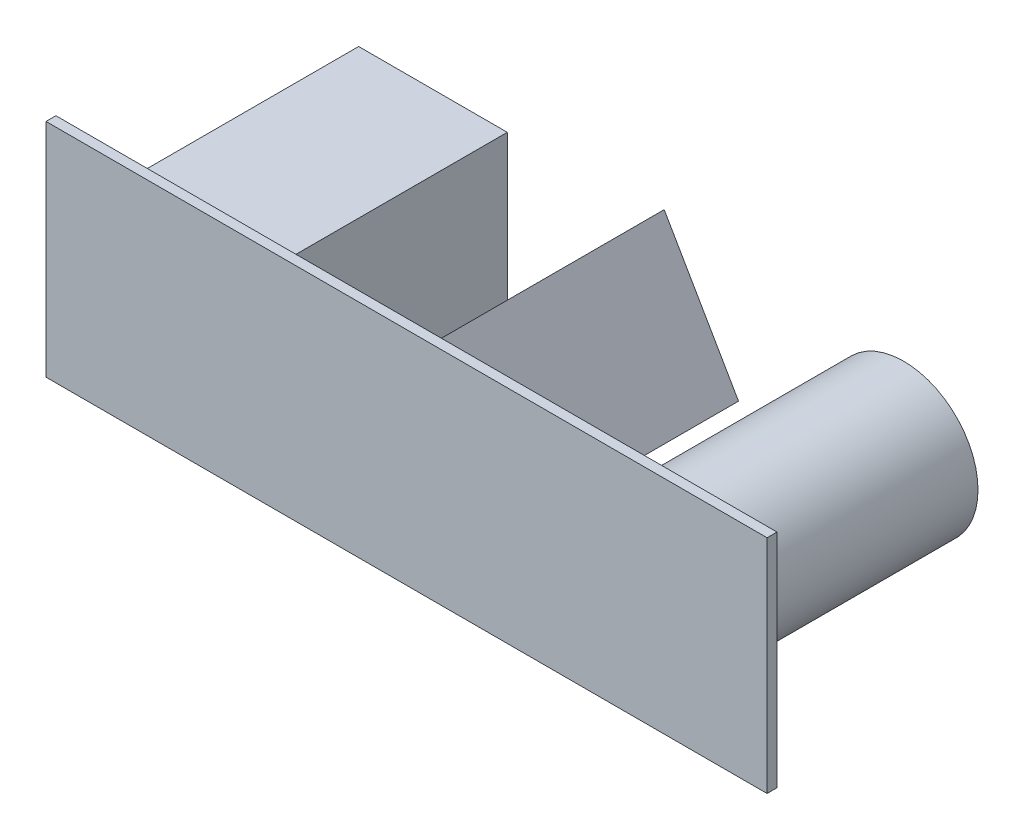
ISO-10303-21;
HEADER;
FILE_DESCRIPTION(('STEP AP214'),'2;1');
FILE_NAME('part.step','',(''),(''),'','','');
FILE_SCHEMA(('AUTOMOTIVE_DESIGN { 1 0 10303 214 1 1 1 1 }'));
ENDSEC;
DATA;
#1=APPLICATION_CONTEXT('core data for automotive mechanical design processes');
#2=APPLICATION_PROTOCOL_DEFINITION('international standard','automotive_design',2000,#1);
#3=PRODUCT_CONTEXT('',#1,'mechanical');
#4=PRODUCT('Part','Part','',(#3));
#5=PRODUCT_RELATED_PRODUCT_CATEGORY('part','',(#4));
#6=PRODUCT_DEFINITION_FORMATION('','',#4);
#7=PRODUCT_DEFINITION_CONTEXT('part definition',#1,'design');
#8=PRODUCT_DEFINITION('design','',#6,#7);
#9=PRODUCT_DEFINITION_SHAPE('','',#8);
#10=(LENGTH_UNIT() NAMED_UNIT(*) SI_UNIT(.MILLI.,.METRE.));
#11=(NAMED_UNIT(*) PLANE_ANGLE_UNIT() SI_UNIT($,.RADIAN.));
#12=(NAMED_UNIT(*) SI_UNIT($,.STERADIAN.) SOLID_ANGLE_UNIT());
#13=UNCERTAINTY_MEASURE_WITH_UNIT(LENGTH_MEASURE(1.E-05),#10,'distance_accuracy_value','');
#14=(GEOMETRIC_REPRESENTATION_CONTEXT(3) GLOBAL_UNCERTAINTY_ASSIGNED_CONTEXT((#13)) GLOBAL_UNIT_ASSIGNED_CONTEXT((#10,
#11,#12)) REPRESENTATION_CONTEXT('',''));
#15=CARTESIAN_POINT('',(0.,0.,0.));
#16=DIRECTION('',(0.,0.,1.));
#17=DIRECTION('',(1.,0.,0.));
#18=AXIS2_PLACEMENT_3D('',#15,#16,#17);
#19=CARTESIAN_POINT('',(0.,-12.9903810567665,75.));
#20=DIRECTION('',(0.,-1.,0.));
#21=DIRECTION('',(1.,0.,0.));
#22=AXIS2_PLACEMENT_3D('',#19,#20,#21);
#23=PLANE('',#22);
#24=DIRECTION('',(-1.,0.,0.));
#25=VECTOR('',#24,1.);
#26=CARTESIAN_POINT('',(0.,-12.9903810567665,0.));
#27=LINE('',#26,#25);
#28=CARTESIAN_POINT('',(22.5,-12.9903810567665,0.));
#29=VERTEX_POINT('',#28);
#30=CARTESIAN_POINT('',(-22.5,-12.9903810567665,0.));
#31=VERTEX_POINT('',#30);
#32=EDGE_CURVE('E211',#29,#31,#27,.T.);
#33=ORIENTED_EDGE('',*,*,#32,.F.);
#34=DIRECTION('',(0.,0.,-1.));
#35=VECTOR('',#34,1.);
#36=CARTESIAN_POINT('',(22.5,-12.9903810567665,75.));
#37=LINE('',#36,#35);
#38=CARTESIAN_POINT('',(22.5,-12.9903810567665,75.));
#39=VERTEX_POINT('',#38);
#40=EDGE_CURVE('E49',#39,#29,#37,.T.);
#41=ORIENTED_EDGE('',*,*,#40,.F.);
#42=DIRECTION('',(-1.,0.,0.));
#43=VECTOR('',#42,1.);
#44=CARTESIAN_POINT('',(0.,-12.9903810567665,75.));
#45=LINE('',#44,#43);
#46=CARTESIAN_POINT('',(-22.5,-12.9903810567665,75.));
#47=VERTEX_POINT('',#46);
#48=EDGE_CURVE('E212',#39,#47,#45,.T.);
#49=ORIENTED_EDGE('',*,*,#48,.T.);
#50=DIRECTION('',(0.,0.,-1.));
#51=VECTOR('',#50,1.);
#52=CARTESIAN_POINT('',(-22.5,-12.9903810567665,75.));
#53=LINE('',#52,#51);
#54=EDGE_CURVE('E225',#47,#31,#53,.T.);
#55=ORIENTED_EDGE('',*,*,#54,.T.);
#56=EDGE_LOOP('',(#33,#41,#49,#55));
#57=FACE_BOUND('',#56,.T.);
#58=ADVANCED_FACE('F41',(#57),#23,.T.);
#59=CARTESIAN_POINT('',(11.25,6.4951905283833,75.));
#60=DIRECTION('',(0.866025403784438,0.5,0.));
#61=DIRECTION('',(-0.5,0.866025403784439,0.));
#62=AXIS2_PLACEMENT_3D('',#59,#60,#61);
#63=PLANE('',#62);
#64=DIRECTION('',(0.5,-0.866025403784439,0.));
#65=VECTOR('',#64,1.);
#66=CARTESIAN_POINT('',(11.25,6.4951905283833,0.));
#67=LINE('',#66,#65);
#68=CARTESIAN_POINT('',(0.,25.9807621135332,0.));
#69=VERTEX_POINT('',#68);
#70=EDGE_CURVE('E229',#69,#29,#67,.T.);
#71=ORIENTED_EDGE('',*,*,#70,.F.);
#72=DIRECTION('',(0.,0.,-1.));
#73=VECTOR('',#72,1.);
#74=CARTESIAN_POINT('',(0.,25.9807621135332,75.));
#75=LINE('',#74,#73);
#76=CARTESIAN_POINT('',(0.,25.9807621135332,75.));
#77=VERTEX_POINT('',#76);
#78=EDGE_CURVE('E238',#77,#69,#75,.T.);
#79=ORIENTED_EDGE('',*,*,#78,.F.);
#80=DIRECTION('',(0.5,-0.866025403784439,0.));
#81=VECTOR('',#80,1.);
#82=CARTESIAN_POINT('',(11.25,6.4951905283833,75.));
#83=LINE('',#82,#81);
#84=EDGE_CURVE('E216',#77,#39,#83,.T.);
#85=ORIENTED_EDGE('',*,*,#84,.T.);
#86=ORIENTED_EDGE('',*,*,#40,.T.);
#87=EDGE_LOOP('',(#71,#79,#85,#86));
#88=FACE_BOUND('',#87,.T.);
#89=ADVANCED_FACE('F245',(#88),#63,.T.);
#90=CARTESIAN_POINT('',(-11.25,6.49519052838329,75.));
#91=DIRECTION('',(-0.866025403784439,0.5,0.));
#92=DIRECTION('',(-0.5,-0.866025403784439,0.));
#93=AXIS2_PLACEMENT_3D('',#90,#91,#92);
#94=PLANE('',#93);
#95=DIRECTION('',(0.5,0.866025403784439,0.));
#96=VECTOR('',#95,1.);
#97=CARTESIAN_POINT('',(-11.25,6.49519052838329,0.));
#98=LINE('',#97,#96);
#99=EDGE_CURVE('E217',#31,#69,#98,.T.);
#100=ORIENTED_EDGE('',*,*,#99,.F.);
#101=ORIENTED_EDGE('',*,*,#54,.F.);
#102=DIRECTION('',(0.5,0.866025403784439,0.));
#103=VECTOR('',#102,1.);
#104=CARTESIAN_POINT('',(-11.25,6.49519052838329,75.));
#105=LINE('',#104,#103);
#106=EDGE_CURVE('E221',#47,#77,#105,.T.);
#107=ORIENTED_EDGE('',*,*,#106,.T.);
#108=ORIENTED_EDGE('',*,*,#78,.T.);
#109=EDGE_LOOP('',(#100,#101,#107,#108));
#110=FACE_BOUND('',#109,.T.);
#111=ADVANCED_FACE('F253',(#110),#94,.T.);
#112=CARTESIAN_POINT('',(0.,0.,0.));
#113=DIRECTION('',(0.,0.,1.));
#114=DIRECTION('',(1.,0.,0.));
#115=AXIS2_PLACEMENT_3D('',#112,#113,#114);
#116=PLANE('',#115);
#117=ORIENTED_EDGE('',*,*,#32,.T.);
#118=ORIENTED_EDGE('',*,*,#99,.T.);
#119=ORIENTED_EDGE('',*,*,#70,.T.);
#120=EDGE_LOOP('',(#117,#118,#119));
#121=FACE_BOUND('',#120,.T.);
#122=ADVANCED_FACE('F251',(#121),#116,.F.);
#123=CARTESIAN_POINT('',(-109.148671952805,-33.5279328530498,78.));
#124=DIRECTION('',(1.,0.,0.));
#125=DIRECTION('',(0.,0.,-1.));
#126=AXIS2_PLACEMENT_3D('',#123,#124,#125);
#127=PLANE('',#126);
#128=DIRECTION('',(0.,-1.,0.));
#129=VECTOR('',#128,1.);
#130=CARTESIAN_POINT('',(-109.148671952805,-33.5279328530498,75.));
#131=LINE('',#130,#129);
#132=CARTESIAN_POINT('',(-109.148671952805,33.5279328530498,75.));
#133=VERTEX_POINT('',#132);
#134=CARTESIAN_POINT('',(-109.148671952805,-33.5279328530498,75.));
#135=VERTEX_POINT('',#134);
#136=EDGE_CURVE('E169',#133,#135,#131,.T.);
#137=ORIENTED_EDGE('',*,*,#136,.T.);
#138=DIRECTION('',(0.,0.,-1.));
#139=VECTOR('',#138,1.);
#140=CARTESIAN_POINT('',(-109.148671952805,-33.5279328530498,78.));
#141=LINE('',#140,#139);
#142=CARTESIAN_POINT('',(-109.148671952805,-33.5279328530498,78.));
#143=VERTEX_POINT('',#142);
#144=EDGE_CURVE('E207',#143,#135,#141,.T.);
#145=ORIENTED_EDGE('',*,*,#144,.F.);
#146=DIRECTION('',(0.,-1.,0.));
#147=VECTOR('',#146,1.);
#148=CARTESIAN_POINT('',(-109.148671952805,-33.5279328530498,78.));
#149=LINE('',#148,#147);
#150=CARTESIAN_POINT('',(-109.148671952805,33.5279328530498,78.));
#151=VERTEX_POINT('',#150);
#152=EDGE_CURVE('E170',#151,#143,#149,.T.);
#153=ORIENTED_EDGE('',*,*,#152,.F.);
#154=DIRECTION('',(0.,0.,-1.));
#155=VECTOR('',#154,1.);
#156=CARTESIAN_POINT('',(-109.148671952805,33.5279328530498,78.));
#157=LINE('',#156,#155);
#158=EDGE_CURVE('E184',#151,#133,#157,.T.);
#159=ORIENTED_EDGE('',*,*,#158,.T.);
#160=EDGE_LOOP('',(#137,#145,#153,#159));
#161=FACE_BOUND('',#160,.T.);
#162=ADVANCED_FACE('F265',(#161),#127,.F.);
#163=CARTESIAN_POINT('',(109.148671952805,-33.5279328530498,78.));
#164=DIRECTION('',(0.,1.,0.));
#165=DIRECTION('',(0.,0.,1.));
#166=AXIS2_PLACEMENT_3D('',#163,#164,#165);
#167=PLANE('',#166);
#168=DIRECTION('',(1.,0.,0.));
#169=VECTOR('',#168,1.);
#170=CARTESIAN_POINT('',(109.148671952805,-33.5279328530498,75.));
#171=LINE('',#170,#169);
#172=CARTESIAN_POINT('',(109.148671952805,-33.5279328530498,75.));
#173=VERTEX_POINT('',#172);
#174=EDGE_CURVE('E188',#135,#173,#171,.T.);
#175=ORIENTED_EDGE('',*,*,#174,.T.);
#176=DIRECTION('',(0.,0.,-1.));
#177=VECTOR('',#176,1.);
#178=CARTESIAN_POINT('',(109.148671952805,-33.5279328530498,78.));
#179=LINE('',#178,#177);
#180=CARTESIAN_POINT('',(109.148671952805,-33.5279328530498,78.));
#181=VERTEX_POINT('',#180);
#182=EDGE_CURVE('E203',#181,#173,#179,.T.);
#183=ORIENTED_EDGE('',*,*,#182,.F.);
#184=DIRECTION('',(1.,0.,0.));
#185=VECTOR('',#184,1.);
#186=CARTESIAN_POINT('',(109.148671952805,-33.5279328530498,78.));
#187=LINE('',#186,#185);
#188=EDGE_CURVE('E174',#143,#181,#187,.T.);
#189=ORIENTED_EDGE('',*,*,#188,.F.);
#190=ORIENTED_EDGE('',*,*,#144,.T.);
#191=EDGE_LOOP('',(#175,#183,#189,#190));
#192=FACE_BOUND('',#191,.T.);
#193=ADVANCED_FACE('F277',(#192),#167,.F.);
#194=CARTESIAN_POINT('',(109.148671952805,-33.5279328530498,78.));
#195=DIRECTION('',(-1.,0.,0.));
#196=DIRECTION('',(0.,0.,1.));
#197=AXIS2_PLACEMENT_3D('',#194,#195,#196);
#198=PLANE('',#197);
#199=DIRECTION('',(0.,1.,0.));
#200=VECTOR('',#199,1.);
#201=CARTESIAN_POINT('',(109.148671952805,-33.5279328530498,75.));
#202=LINE('',#201,#200);
#203=CARTESIAN_POINT('',(109.148671952805,33.5279328530498,75.));
#204=VERTEX_POINT('',#203);
#205=EDGE_CURVE('E191',#173,#204,#202,.T.);
#206=ORIENTED_EDGE('',*,*,#205,.T.);
#207=DIRECTION('',(0.,0.,-1.));
#208=VECTOR('',#207,1.);
#209=CARTESIAN_POINT('',(109.148671952805,33.5279328530498,78.));
#210=LINE('',#209,#208);
#211=CARTESIAN_POINT('',(109.148671952805,33.5279328530498,78.));
#212=VERTEX_POINT('',#211);
#213=EDGE_CURVE('E199',#212,#204,#210,.T.);
#214=ORIENTED_EDGE('',*,*,#213,.F.);
#215=DIRECTION('',(0.,1.,0.));
#216=VECTOR('',#215,1.);
#217=CARTESIAN_POINT('',(109.148671952805,-33.5279328530498,78.));
#218=LINE('',#217,#216);
#219=EDGE_CURVE('E178',#181,#212,#218,.T.);
#220=ORIENTED_EDGE('',*,*,#219,.F.);
#221=ORIENTED_EDGE('',*,*,#182,.T.);
#222=EDGE_LOOP('',(#206,#214,#220,#221));
#223=FACE_BOUND('',#222,.T.);
#224=ADVANCED_FACE('F274',(#223),#198,.F.);
#225=CARTESIAN_POINT('',(109.148671952805,33.5279328530498,78.));
#226=DIRECTION('',(0.,-1.,0.));
#227=DIRECTION('',(0.,0.,-1.));
#228=AXIS2_PLACEMENT_3D('',#225,#226,#227);
#229=PLANE('',#228);
#230=DIRECTION('',(-1.,0.,0.));
#231=VECTOR('',#230,1.);
#232=CARTESIAN_POINT('',(109.148671952805,33.5279328530498,75.));
#233=LINE('',#232,#231);
#234=EDGE_CURVE('E175',#204,#133,#233,.T.);
#235=ORIENTED_EDGE('',*,*,#234,.T.);
#236=ORIENTED_EDGE('',*,*,#158,.F.);
#237=DIRECTION('',(-1.,0.,0.));
#238=VECTOR('',#237,1.);
#239=CARTESIAN_POINT('',(109.148671952805,33.5279328530498,78.));
#240=LINE('',#239,#238);
#241=EDGE_CURVE('E181',#212,#151,#240,.T.);
#242=ORIENTED_EDGE('',*,*,#241,.F.);
#243=ORIENTED_EDGE('',*,*,#213,.T.);
#244=EDGE_LOOP('',(#235,#236,#242,#243));
#245=FACE_BOUND('',#244,.T.);
#246=ADVANCED_FACE('F270',(#245),#229,.F.);
#247=CARTESIAN_POINT('',(0.,0.,78.));
#248=DIRECTION('',(0.,0.,1.));
#249=DIRECTION('',(1.,0.,0.));
#250=AXIS2_PLACEMENT_3D('',#247,#248,#249);
#251=PLANE('',#250);
#252=ORIENTED_EDGE('',*,*,#152,.T.);
#253=ORIENTED_EDGE('',*,*,#188,.T.);
#254=ORIENTED_EDGE('',*,*,#219,.T.);
#255=ORIENTED_EDGE('',*,*,#241,.T.);
#256=EDGE_LOOP('',(#252,#253,#254,#255));
#257=FACE_BOUND('',#256,.T.);
#258=ADVANCED_FACE('F257',(#257),#251,.T.);
#259=CARTESIAN_POINT('',(0.,0.,75.));
#260=DIRECTION('',(0.,0.,1.));
#261=DIRECTION('',(1.,0.,0.));
#262=AXIS2_PLACEMENT_3D('',#259,#260,#261);
#263=PLANE('',#262);
#264=CARTESIAN_POINT('',(72.5,0.,75.));
#265=DIRECTION('',(0.,0.,1.));
#266=DIRECTION('',(1.,0.,0.));
#267=AXIS2_PLACEMENT_3D('',#264,#265,#266);
#268=CIRCLE('',#267,22.5);
#269=CARTESIAN_POINT('',(95.,0.,75.));
#270=VERTEX_POINT('',#269);
#271=EDGE_CURVE('E11',#270,#270,#268,.F.);
#272=ORIENTED_EDGE('',*,*,#271,.F.);
#273=EDGE_LOOP('',(#272));
#274=FACE_BOUND('',#273,.T.);
#275=DIRECTION('',(1.,0.,0.));
#276=VECTOR('',#275,1.);
#277=CARTESIAN_POINT('',(0.,-22.5,75.));
#278=LINE('',#277,#276);
#279=CARTESIAN_POINT('',(-92.5,-22.5,75.));
#280=VERTEX_POINT('',#279);
#281=CARTESIAN_POINT('',(-47.5,-22.5,75.));
#282=VERTEX_POINT('',#281);
#283=EDGE_CURVE('E126',#280,#282,#278,.T.);
#284=ORIENTED_EDGE('',*,*,#283,.T.);
#285=DIRECTION('',(0.,-1.,0.));
#286=VECTOR('',#285,1.);
#287=CARTESIAN_POINT('',(-47.5,0.,75.));
#288=LINE('',#287,#286);
#289=CARTESIAN_POINT('',(-47.5,22.5,75.));
#290=VERTEX_POINT('',#289);
#291=EDGE_CURVE('E56',#290,#282,#288,.T.);
#292=ORIENTED_EDGE('',*,*,#291,.F.);
#293=DIRECTION('',(1.,0.,0.));
#294=VECTOR('',#293,1.);
#295=CARTESIAN_POINT('',(0.,22.5000000000001,75.));
#296=LINE('',#295,#294);
#297=CARTESIAN_POINT('',(-92.5,22.5,75.));
#298=VERTEX_POINT('',#297);
#299=EDGE_CURVE('E61',#298,#290,#296,.T.);
#300=ORIENTED_EDGE('',*,*,#299,.F.);
#301=DIRECTION('',(0.,-1.,0.));
#302=VECTOR('',#301,1.);
#303=CARTESIAN_POINT('',(-92.5,0.,75.));
#304=LINE('',#303,#302);
#305=EDGE_CURVE('E121',#298,#280,#304,.T.);
#306=ORIENTED_EDGE('',*,*,#305,.T.);
#307=EDGE_LOOP('',(#284,#292,#300,#306));
#308=FACE_BOUND('',#307,.T.);
#309=ORIENTED_EDGE('',*,*,#48,.F.);
#310=ORIENTED_EDGE('',*,*,#84,.F.);
#311=ORIENTED_EDGE('',*,*,#106,.F.);
#312=EDGE_LOOP('',(#309,#310,#311));
#313=FACE_BOUND('',#312,.T.);
#314=ORIENTED_EDGE('',*,*,#136,.F.);
#315=ORIENTED_EDGE('',*,*,#234,.F.);
#316=ORIENTED_EDGE('',*,*,#205,.F.);
#317=ORIENTED_EDGE('',*,*,#174,.F.);
#318=EDGE_LOOP('',(#314,#315,#316,#317));
#319=FACE_BOUND('',#318,.T.);
#320=ADVANCED_FACE('F123',(#274,#308,#313,#319),#263,.F.);
#321=CARTESIAN_POINT('',(-47.5,0.,75.));
#322=DIRECTION('',(1.,0.,0.));
#323=DIRECTION('',(0.,1.,0.));
#324=AXIS2_PLACEMENT_3D('',#321,#322,#323);
#325=PLANE('',#324);
#326=DIRECTION('',(0.,-1.,0.));
#327=VECTOR('',#326,1.);
#328=CARTESIAN_POINT('',(-47.5,0.,0.));
#329=LINE('',#328,#327);
#330=CARTESIAN_POINT('',(-47.5,22.5,0.));
#331=VERTEX_POINT('',#330);
#332=CARTESIAN_POINT('',(-47.5,-22.5,0.));
#333=VERTEX_POINT('',#332);
#334=EDGE_CURVE('E150',#331,#333,#329,.T.);
#335=ORIENTED_EDGE('',*,*,#334,.F.);
#336=DIRECTION('',(0.,0.,-1.));
#337=VECTOR('',#336,1.);
#338=CARTESIAN_POINT('',(-47.5,22.5,75.));
#339=LINE('',#338,#337);
#340=EDGE_CURVE('E166',#290,#331,#339,.T.);
#341=ORIENTED_EDGE('',*,*,#340,.F.);
#342=ORIENTED_EDGE('',*,*,#291,.T.);
#343=DIRECTION('',(0.,0.,-1.));
#344=VECTOR('',#343,1.);
#345=CARTESIAN_POINT('',(-47.5,-22.5,75.));
#346=LINE('',#345,#344);
#347=EDGE_CURVE('E141',#282,#333,#346,.T.);
#348=ORIENTED_EDGE('',*,*,#347,.T.);
#349=EDGE_LOOP('',(#335,#341,#342,#348));
#350=FACE_BOUND('',#349,.T.);
#351=ADVANCED_FACE('F256',(#350),#325,.T.);
#352=CARTESIAN_POINT('',(0.,22.5000000000001,75.));
#353=DIRECTION('',(0.,1.,0.));
#354=DIRECTION('',(-1.,0.,0.));
#355=AXIS2_PLACEMENT_3D('',#352,#353,#354);
#356=PLANE('',#355);
#357=DIRECTION('',(1.,0.,0.));
#358=VECTOR('',#357,1.);
#359=CARTESIAN_POINT('',(0.,22.5000000000001,0.));
#360=LINE('',#359,#358);
#361=CARTESIAN_POINT('',(-92.5,22.5,0.));
#362=VERTEX_POINT('',#361);
#363=EDGE_CURVE('E154',#362,#331,#360,.T.);
#364=ORIENTED_EDGE('',*,*,#363,.F.);
#365=DIRECTION('',(0.,0.,-1.));
#366=VECTOR('',#365,1.);
#367=CARTESIAN_POINT('',(-92.5,22.5,75.));
#368=LINE('',#367,#366);
#369=EDGE_CURVE('E140',#298,#362,#368,.T.);
#370=ORIENTED_EDGE('',*,*,#369,.F.);
#371=ORIENTED_EDGE('',*,*,#299,.T.);
#372=ORIENTED_EDGE('',*,*,#340,.T.);
#373=EDGE_LOOP('',(#364,#370,#371,#372));
#374=FACE_BOUND('',#373,.T.);
#375=ADVANCED_FACE('F329',(#374),#356,.T.);
#376=CARTESIAN_POINT('',(-92.5,0.,75.));
#377=DIRECTION('',(1.,0.,0.));
#378=DIRECTION('',(0.,1.,0.));
#379=AXIS2_PLACEMENT_3D('',#376,#377,#378);
#380=PLANE('',#379);
#381=DIRECTION('',(0.,-1.,0.));
#382=VECTOR('',#381,1.);
#383=CARTESIAN_POINT('',(-92.5,0.,0.));
#384=LINE('',#383,#382);
#385=CARTESIAN_POINT('',(-92.5,-22.5,0.));
#386=VERTEX_POINT('',#385);
#387=EDGE_CURVE('E135',#362,#386,#384,.T.);
#388=ORIENTED_EDGE('',*,*,#387,.T.);
#389=DIRECTION('',(0.,0.,-1.));
#390=VECTOR('',#389,1.);
#391=CARTESIAN_POINT('',(-92.5,-22.5,75.));
#392=LINE('',#391,#390);
#393=EDGE_CURVE('E132',#280,#386,#392,.T.);
#394=ORIENTED_EDGE('',*,*,#393,.F.);
#395=ORIENTED_EDGE('',*,*,#305,.F.);
#396=ORIENTED_EDGE('',*,*,#369,.T.);
#397=EDGE_LOOP('',(#388,#394,#395,#396));
#398=FACE_BOUND('',#397,.T.);
#399=ADVANCED_FACE('F133',(#398),#380,.F.);
#400=CARTESIAN_POINT('',(0.,-22.5,75.));
#401=DIRECTION('',(0.,1.,0.));
#402=DIRECTION('',(-1.,0.,0.));
#403=AXIS2_PLACEMENT_3D('',#400,#401,#402);
#404=PLANE('',#403);
#405=DIRECTION('',(1.,0.,0.));
#406=VECTOR('',#405,1.);
#407=CARTESIAN_POINT('',(0.,-22.5,0.));
#408=LINE('',#407,#406);
#409=EDGE_CURVE('E161',#386,#333,#408,.T.);
#410=ORIENTED_EDGE('',*,*,#409,.T.);
#411=ORIENTED_EDGE('',*,*,#347,.F.);
#412=ORIENTED_EDGE('',*,*,#283,.F.);
#413=ORIENTED_EDGE('',*,*,#393,.T.);
#414=EDGE_LOOP('',(#410,#411,#412,#413));
#415=FACE_BOUND('',#414,.T.);
#416=ADVANCED_FACE('F143',(#415),#404,.F.);
#417=CARTESIAN_POINT('',(0.,0.,0.));
#418=DIRECTION('',(0.,0.,1.));
#419=DIRECTION('',(1.,0.,0.));
#420=AXIS2_PLACEMENT_3D('',#417,#418,#419);
#421=PLANE('',#420);
#422=ORIENTED_EDGE('',*,*,#334,.T.);
#423=ORIENTED_EDGE('',*,*,#409,.F.);
#424=ORIENTED_EDGE('',*,*,#387,.F.);
#425=ORIENTED_EDGE('',*,*,#363,.T.);
#426=EDGE_LOOP('',(#422,#423,#424,#425));
#427=FACE_BOUND('',#426,.T.);
#428=ADVANCED_FACE('F356',(#427),#421,.F.);
#429=CARTESIAN_POINT('',(72.5,0.,75.));
#430=DIRECTION('',(0.,0.,-1.));
#431=DIRECTION('',(-1.,0.,0.));
#432=AXIS2_PLACEMENT_3D('',#429,#430,#431);
#433=CYLINDRICAL_SURFACE('',#432,22.5);
#434=ORIENTED_EDGE('',*,*,#271,.T.);
#435=EDGE_LOOP('',(#434));
#436=FACE_BOUND('',#435,.T.);
#437=CARTESIAN_POINT('',(72.5,0.,0.));
#438=DIRECTION('',(0.,0.,1.));
#439=DIRECTION('',(1.,0.,0.));
#440=AXIS2_PLACEMENT_3D('',#437,#438,#439);
#441=CIRCLE('',#440,22.5);
#442=CARTESIAN_POINT('',(95.,0.,0.));
#443=VERTEX_POINT('',#442);
#444=EDGE_CURVE('E155',#443,#443,#441,.T.);
#445=ORIENTED_EDGE('',*,*,#444,.T.);
#446=EDGE_LOOP('',(#445));
#447=FACE_BOUND('',#446,.T.);
#448=ADVANCED_FACE('F365',(#436,#447),#433,.T.);
#449=CARTESIAN_POINT('',(0.,0.,0.));
#450=DIRECTION('',(0.,0.,1.));
#451=DIRECTION('',(1.,0.,0.));
#452=AXIS2_PLACEMENT_3D('',#449,#450,#451);
#453=PLANE('',#452);
#454=ORIENTED_EDGE('',*,*,#444,.F.);
#455=EDGE_LOOP('',(#454));
#456=FACE_BOUND('',#455,.T.);
#457=ADVANCED_FACE('F375',(#456),#453,.F.);
#458=CLOSED_SHELL('',(#58,#89,#111,#122,#162,#193,#224,#246,#258,#320,#351,#375,#399,#416,#428,
#448,#457));
#459=MANIFOLD_SOLID_BREP('B2',#458);
#460=ADVANCED_BREP_SHAPE_REPRESENTATION('',(#18,#459),#14);
#461=SHAPE_DEFINITION_REPRESENTATION(#9,#460);
ENDSEC;
END-ISO-10303-21;
